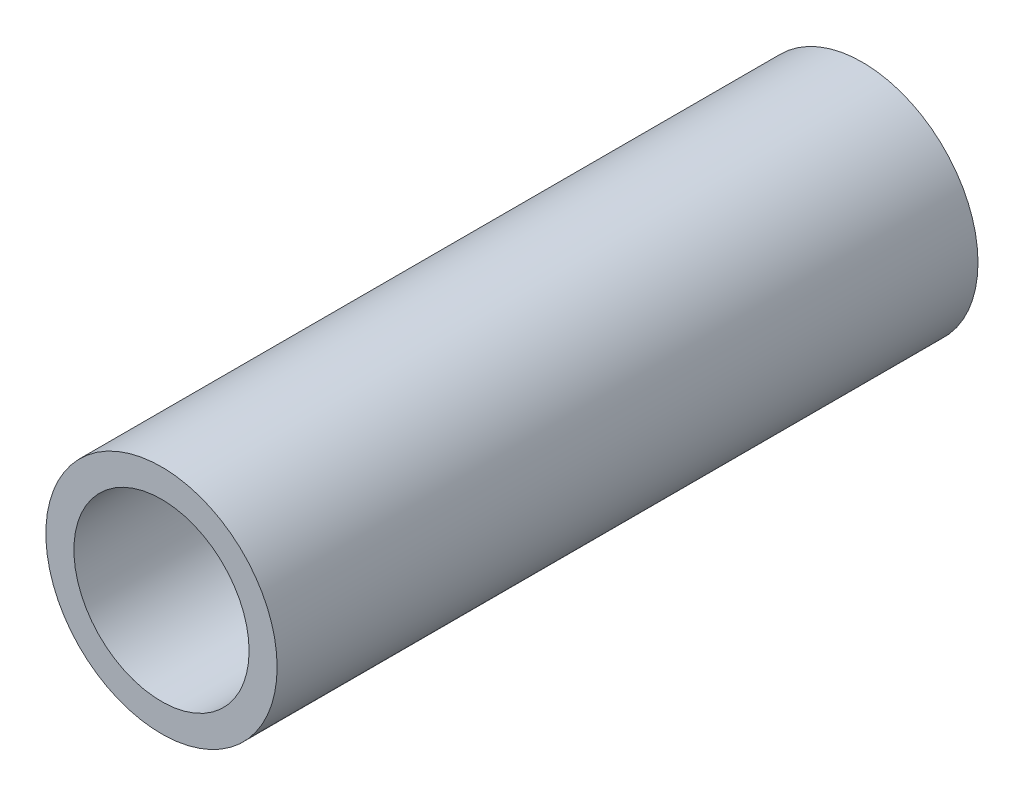
ISO-10303-21;
HEADER;
FILE_DESCRIPTION(('STEP AP214'),'2;1');
FILE_NAME('part.step','',(''),(''),'','','');
FILE_SCHEMA(('AUTOMOTIVE_DESIGN { 1 0 10303 214 1 1 1 1 }'));
ENDSEC;
DATA;
#1=APPLICATION_CONTEXT('core data for automotive mechanical design processes');
#2=APPLICATION_PROTOCOL_DEFINITION('international standard','automotive_design',2000,#1);
#3=PRODUCT_CONTEXT('',#1,'mechanical');
#4=PRODUCT('Part','Part','',(#3));
#5=PRODUCT_RELATED_PRODUCT_CATEGORY('part','',(#4));
#6=PRODUCT_DEFINITION_FORMATION('','',#4);
#7=PRODUCT_DEFINITION_CONTEXT('part definition',#1,'design');
#8=PRODUCT_DEFINITION('design','',#6,#7);
#9=PRODUCT_DEFINITION_SHAPE('','',#8);
#10=(LENGTH_UNIT() NAMED_UNIT(*) SI_UNIT(.MILLI.,.METRE.));
#11=(NAMED_UNIT(*) PLANE_ANGLE_UNIT() SI_UNIT($,.RADIAN.));
#12=(NAMED_UNIT(*) SI_UNIT($,.STERADIAN.) SOLID_ANGLE_UNIT());
#13=UNCERTAINTY_MEASURE_WITH_UNIT(LENGTH_MEASURE(1.E-05),#10,'distance_accuracy_value','');
#14=(GEOMETRIC_REPRESENTATION_CONTEXT(3) GLOBAL_UNCERTAINTY_ASSIGNED_CONTEXT((#13)) GLOBAL_UNIT_ASSIGNED_CONTEXT((#10,
#11,#12)) REPRESENTATION_CONTEXT('',''));
#15=CARTESIAN_POINT('',(0.,0.,0.));
#16=DIRECTION('',(0.,0.,1.));
#17=DIRECTION('',(1.,0.,0.));
#18=AXIS2_PLACEMENT_3D('',#15,#16,#17);
#19=CARTESIAN_POINT('',(0.,0.,100.));
#20=DIRECTION('',(0.,0.,1.));
#21=DIRECTION('',(1.,0.,0.));
#22=AXIS2_PLACEMENT_3D('',#19,#20,#21);
#23=PLANE('',#22);
#24=CARTESIAN_POINT('',(0.,0.,100.));
#25=DIRECTION('',(0.,0.,1.));
#26=DIRECTION('',(1.,0.,0.));
#27=AXIS2_PLACEMENT_3D('',#24,#25,#26);
#28=CIRCLE('',#27,16.5);
#29=CARTESIAN_POINT('',(16.5,0.,100.));
#30=VERTEX_POINT('',#29);
#31=EDGE_CURVE('E10',#30,#30,#28,.T.);
#32=ORIENTED_EDGE('',*,*,#31,.T.);
#33=EDGE_LOOP('',(#32));
#34=FACE_BOUND('',#33,.T.);
#35=CARTESIAN_POINT('',(0.,0.,100.));
#36=DIRECTION('',(0.,0.,1.));
#37=DIRECTION('',(1.,0.,0.));
#38=AXIS2_PLACEMENT_3D('',#35,#36,#37);
#39=CIRCLE('',#38,12.5);
#40=CARTESIAN_POINT('',(12.5,0.,100.));
#41=VERTEX_POINT('',#40);
#42=EDGE_CURVE('E50',#41,#41,#39,.T.);
#43=ORIENTED_EDGE('',*,*,#42,.F.);
#44=EDGE_LOOP('',(#43));
#45=FACE_BOUND('',#44,.T.);
#46=ADVANCED_FACE('F37',(#34,#45),#23,.T.);
#47=CARTESIAN_POINT('',(0.,0.,0.));
#48=DIRECTION('',(0.,0.,1.));
#49=DIRECTION('',(1.,0.,0.));
#50=AXIS2_PLACEMENT_3D('',#47,#48,#49);
#51=PLANE('',#50);
#52=CARTESIAN_POINT('',(0.,0.,0.));
#53=DIRECTION('',(0.,0.,1.));
#54=DIRECTION('',(1.,0.,0.));
#55=AXIS2_PLACEMENT_3D('',#52,#53,#54);
#56=CIRCLE('',#55,16.5);
#57=CARTESIAN_POINT('',(16.5,0.,0.));
#58=VERTEX_POINT('',#57);
#59=EDGE_CURVE('E41',#58,#58,#56,.T.);
#60=ORIENTED_EDGE('',*,*,#59,.F.);
#61=EDGE_LOOP('',(#60));
#62=FACE_BOUND('',#61,.T.);
#63=CARTESIAN_POINT('',(0.,0.,0.));
#64=DIRECTION('',(0.,0.,1.));
#65=DIRECTION('',(1.,0.,0.));
#66=AXIS2_PLACEMENT_3D('',#63,#64,#65);
#67=CIRCLE('',#66,12.5);
#68=CARTESIAN_POINT('',(12.5,0.,0.));
#69=VERTEX_POINT('',#68);
#70=EDGE_CURVE('E52',#69,#69,#67,.T.);
#71=ORIENTED_EDGE('',*,*,#70,.T.);
#72=EDGE_LOOP('',(#71));
#73=FACE_BOUND('',#72,.T.);
#74=ADVANCED_FACE('F64',(#62,#73),#51,.F.);
#75=CARTESIAN_POINT('',(0.,0.,100.));
#76=DIRECTION('',(0.,0.,-1.));
#77=DIRECTION('',(-1.,0.,0.));
#78=AXIS2_PLACEMENT_3D('',#75,#76,#77);
#79=CYLINDRICAL_SURFACE('',#78,16.5);
#80=ORIENTED_EDGE('',*,*,#31,.F.);
#81=EDGE_LOOP('',(#80));
#82=FACE_BOUND('',#81,.T.);
#83=ORIENTED_EDGE('',*,*,#59,.T.);
#84=EDGE_LOOP('',(#83));
#85=FACE_BOUND('',#84,.T.);
#86=ADVANCED_FACE('F39',(#82,#85),#79,.T.);
#87=CARTESIAN_POINT('',(0.,0.,100.));
#88=DIRECTION('',(0.,0.,-1.));
#89=DIRECTION('',(-1.,0.,0.));
#90=AXIS2_PLACEMENT_3D('',#87,#88,#89);
#91=CYLINDRICAL_SURFACE('',#90,12.5);
#92=ORIENTED_EDGE('',*,*,#42,.T.);
#93=EDGE_LOOP('',(#92));
#94=FACE_BOUND('',#93,.T.);
#95=ORIENTED_EDGE('',*,*,#70,.F.);
#96=EDGE_LOOP('',(#95));
#97=FACE_BOUND('',#96,.T.);
#98=ADVANCED_FACE('F60',(#94,#97),#91,.F.);
#99=CLOSED_SHELL('',(#46,#74,#86,#98));
#100=MANIFOLD_SOLID_BREP('B2',#99);
#101=ADVANCED_BREP_SHAPE_REPRESENTATION('',(#18,#100),#14);
#102=SHAPE_DEFINITION_REPRESENTATION(#9,#101);
ENDSEC;
END-ISO-10303-21;
